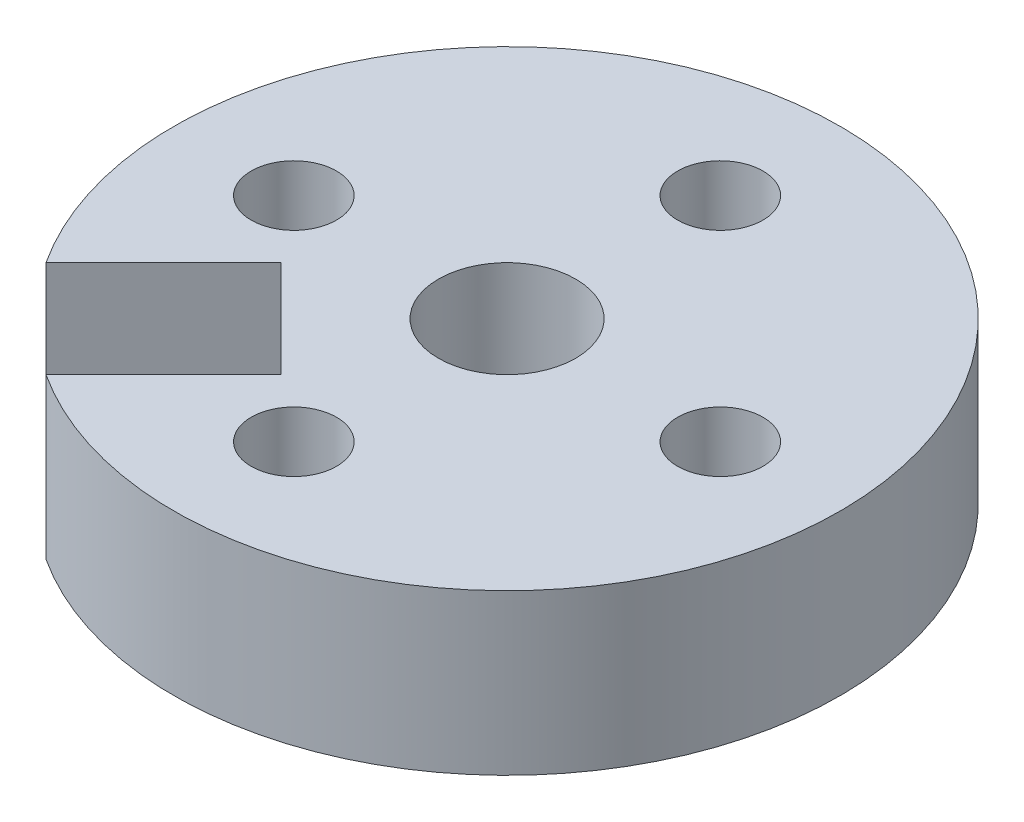
ISO-10303-21;
HEADER;
FILE_DESCRIPTION(('STEP AP214'),'2;1');
FILE_NAME('part.step','',(''),(''),'','','');
FILE_SCHEMA(('AUTOMOTIVE_DESIGN { 1 0 10303 214 1 1 1 1 }'));
ENDSEC;
DATA;
#1=APPLICATION_CONTEXT('core data for automotive mechanical design processes');
#2=APPLICATION_PROTOCOL_DEFINITION('international standard','automotive_design',2000,#1);
#3=PRODUCT_CONTEXT('',#1,'mechanical');
#4=PRODUCT('Part','Part','',(#3));
#5=PRODUCT_RELATED_PRODUCT_CATEGORY('part','',(#4));
#6=PRODUCT_DEFINITION_FORMATION('','',#4);
#7=PRODUCT_DEFINITION_CONTEXT('part definition',#1,'design');
#8=PRODUCT_DEFINITION('design','',#6,#7);
#9=PRODUCT_DEFINITION_SHAPE('','',#8);
#10=(LENGTH_UNIT() NAMED_UNIT(*) SI_UNIT(.MILLI.,.METRE.));
#11=(NAMED_UNIT(*) PLANE_ANGLE_UNIT() SI_UNIT($,.RADIAN.));
#12=(NAMED_UNIT(*) SI_UNIT($,.STERADIAN.) SOLID_ANGLE_UNIT());
#13=UNCERTAINTY_MEASURE_WITH_UNIT(LENGTH_MEASURE(1.E-05),#10,'distance_accuracy_value','');
#14=(GEOMETRIC_REPRESENTATION_CONTEXT(3) GLOBAL_UNCERTAINTY_ASSIGNED_CONTEXT((#13)) GLOBAL_UNIT_ASSIGNED_CONTEXT((#10,
#11,#12)) REPRESENTATION_CONTEXT('',''));
#15=CARTESIAN_POINT('',(0.,0.,0.));
#16=DIRECTION('',(0.,0.,1.));
#17=DIRECTION('',(1.,0.,0.));
#18=AXIS2_PLACEMENT_3D('',#15,#16,#17);
#19=CARTESIAN_POINT('',(0.,6.,0.));
#20=DIRECTION('',(0.,-1.,0.));
#21=DIRECTION('',(0.,0.,-1.));
#22=AXIS2_PLACEMENT_3D('',#19,#20,#21);
#23=CYLINDRICAL_SURFACE('',#22,12.5);
#24=DIRECTION('',(0.,-1.,0.));
#25=VECTOR('',#24,1.);
#26=CARTESIAN_POINT('',(-10.4700593229111,30.,6.82845939980044));
#27=LINE('',#26,#25);
#28=CARTESIAN_POINT('',(-10.4700593229111,6.,6.82845939980044));
#29=VERTEX_POINT('',#28);
#30=CARTESIAN_POINT('',(-10.4700593229111,0.,6.82845939980044));
#31=VERTEX_POINT('',#30);
#32=EDGE_CURVE('E112',#29,#31,#27,.T.);
#33=ORIENTED_EDGE('',*,*,#32,.F.);
#34=CARTESIAN_POINT('',(0.,6.,0.));
#35=DIRECTION('',(0.,1.,0.));
#36=DIRECTION('',(0.,0.,1.));
#37=AXIS2_PLACEMENT_3D('',#34,#35,#36);
#38=CIRCLE('',#37,12.5);
#39=CARTESIAN_POINT('',(-6.8284593998006,6.,10.470059322911));
#40=VERTEX_POINT('',#39);
#41=EDGE_CURVE('E12',#40,#29,#38,.T.);
#42=ORIENTED_EDGE('',*,*,#41,.F.);
#43=DIRECTION('',(0.,-1.,0.));
#44=VECTOR('',#43,1.);
#45=CARTESIAN_POINT('',(-6.8284593998006,30.,10.470059322911));
#46=LINE('',#45,#44);
#47=CARTESIAN_POINT('',(-6.8284593998006,0.,10.470059322911));
#48=VERTEX_POINT('',#47);
#49=EDGE_CURVE('E101',#40,#48,#46,.T.);
#50=ORIENTED_EDGE('',*,*,#49,.T.);
#51=CARTESIAN_POINT('',(0.,0.,0.));
#52=DIRECTION('',(0.,1.,0.));
#53=DIRECTION('',(0.,0.,1.));
#54=AXIS2_PLACEMENT_3D('',#51,#52,#53);
#55=CIRCLE('',#54,12.5);
#56=EDGE_CURVE('E65',#48,#31,#55,.T.);
#57=ORIENTED_EDGE('',*,*,#56,.T.);
#58=EDGE_LOOP('',(#33,#42,#50,#57));
#59=FACE_BOUND('',#58,.T.);
#60=ADVANCED_FACE('F52',(#59),#23,.T.);
#61=CARTESIAN_POINT('',(0.,6.,0.));
#62=DIRECTION('',(0.,1.,0.));
#63=DIRECTION('',(0.,0.,1.));
#64=AXIS2_PLACEMENT_3D('',#61,#62,#63);
#65=PLANE('',#64);
#66=CARTESIAN_POINT('',(0.,6.,0.));
#67=DIRECTION('',(0.,1.,0.));
#68=DIRECTION('',(0.,0.,1.));
#69=AXIS2_PLACEMENT_3D('',#66,#67,#68);
#70=CIRCLE('',#69,2.575);
#71=CARTESIAN_POINT('',(0.,6.,2.575));
#72=VERTEX_POINT('',#71);
#73=EDGE_CURVE('E135',#72,#72,#70,.T.);
#74=ORIENTED_EDGE('',*,*,#73,.F.);
#75=EDGE_LOOP('',(#74));
#76=FACE_BOUND('',#75,.T.);
#77=CARTESIAN_POINT('',(0.,6.,-8.));
#78=DIRECTION('',(0.,1.,0.));
#79=DIRECTION('',(0.,0.,1.));
#80=AXIS2_PLACEMENT_3D('',#77,#78,#79);
#81=CIRCLE('',#80,1.6);
#82=CARTESIAN_POINT('',(0.,6.,-6.4));
#83=VERTEX_POINT('',#82);
#84=EDGE_CURVE('E117',#83,#83,#81,.F.);
#85=ORIENTED_EDGE('',*,*,#84,.T.);
#86=EDGE_LOOP('',(#85));
#87=FACE_BOUND('',#86,.T.);
#88=CARTESIAN_POINT('',(8.,6.,0.));
#89=DIRECTION('',(0.,1.,0.));
#90=DIRECTION('',(0.,0.,1.));
#91=AXIS2_PLACEMENT_3D('',#88,#89,#90);
#92=CIRCLE('',#91,1.60000000000003);
#93=CARTESIAN_POINT('',(8.,6.,1.60000000000003));
#94=VERTEX_POINT('',#93);
#95=EDGE_CURVE('E119',#94,#94,#92,.F.);
#96=ORIENTED_EDGE('',*,*,#95,.T.);
#97=EDGE_LOOP('',(#96));
#98=FACE_BOUND('',#97,.T.);
#99=CARTESIAN_POINT('',(0.,6.,8.));
#100=DIRECTION('',(0.,1.,0.));
#101=DIRECTION('',(0.,0.,1.));
#102=AXIS2_PLACEMENT_3D('',#99,#100,#101);
#103=CIRCLE('',#102,1.60000000000006);
#104=CARTESIAN_POINT('',(0.,6.,9.60000000000006));
#105=VERTEX_POINT('',#104);
#106=EDGE_CURVE('E124',#105,#105,#103,.F.);
#107=ORIENTED_EDGE('',*,*,#106,.T.);
#108=EDGE_LOOP('',(#107));
#109=FACE_BOUND('',#108,.T.);
#110=CARTESIAN_POINT('',(-8.,6.,0.));
#111=DIRECTION('',(0.,1.,0.));
#112=DIRECTION('',(0.,0.,1.));
#113=AXIS2_PLACEMENT_3D('',#110,#111,#112);
#114=CIRCLE('',#113,1.60000000000008);
#115=CARTESIAN_POINT('',(-8.,6.,1.60000000000008));
#116=VERTEX_POINT('',#115);
#117=EDGE_CURVE('E127',#116,#116,#114,.F.);
#118=ORIENTED_EDGE('',*,*,#117,.T.);
#119=EDGE_LOOP('',(#118));
#120=FACE_BOUND('',#119,.T.);
#121=ORIENTED_EDGE('',*,*,#41,.T.);
#122=DIRECTION('',(0.707106781186544,0.,-0.707106781186551));
#123=VECTOR('',#122,1.);
#124=CARTESIAN_POINT('',(-1.82079996155537,6.,-1.82079996155535));
#125=LINE('',#124,#123);
#126=CARTESIAN_POINT('',(-6.06344064867468,6.,2.421840725564));
#127=VERTEX_POINT('',#126);
#128=EDGE_CURVE('E146',#29,#127,#125,.T.);
#129=ORIENTED_EDGE('',*,*,#128,.T.);
#130=DIRECTION('',(0.707106781186551,0.,0.707106781186544));
#131=VECTOR('',#130,1.);
#132=CARTESIAN_POINT('',(-4.24264068711931,6.,4.24264068711935));
#133=LINE('',#132,#131);
#134=CARTESIAN_POINT('',(-2.42184072556394,6.,6.06344064867471));
#135=VERTEX_POINT('',#134);
#136=EDGE_CURVE('E78',#127,#135,#133,.T.);
#137=ORIENTED_EDGE('',*,*,#136,.T.);
#138=DIRECTION('',(0.707106781186579,0.,-0.707106781186516));
#139=VECTOR('',#138,1.);
#140=CARTESIAN_POINT('',(1.82079996155549,6.,1.82079996155566));
#141=LINE('',#140,#139);
#142=EDGE_CURVE('E149',#40,#135,#141,.T.);
#143=ORIENTED_EDGE('',*,*,#142,.F.);
#144=EDGE_LOOP('',(#121,#129,#137,#143));
#145=FACE_BOUND('',#144,.T.);
#146=ADVANCED_FACE('F177',(#76,#87,#98,#109,#120,#145),#65,.T.);
#147=CARTESIAN_POINT('',(0.,0.,0.));
#148=DIRECTION('',(0.,1.,0.));
#149=DIRECTION('',(0.,0.,1.));
#150=AXIS2_PLACEMENT_3D('',#147,#148,#149);
#151=PLANE('',#150);
#152=CARTESIAN_POINT('',(0.,0.,0.));
#153=DIRECTION('',(0.,-1.,0.));
#154=DIRECTION('',(0.,0.,-1.));
#155=AXIS2_PLACEMENT_3D('',#152,#153,#154);
#156=CIRCLE('',#155,2.575);
#157=CARTESIAN_POINT('',(0.,0.,-2.575));
#158=VERTEX_POINT('',#157);
#159=EDGE_CURVE('E157',#158,#158,#156,.T.);
#160=ORIENTED_EDGE('',*,*,#159,.F.);
#161=EDGE_LOOP('',(#160));
#162=FACE_BOUND('',#161,.T.);
#163=CARTESIAN_POINT('',(-8.,0.,0.));
#164=DIRECTION('',(0.,1.,0.));
#165=DIRECTION('',(0.,0.,1.));
#166=AXIS2_PLACEMENT_3D('',#163,#164,#165);
#167=CIRCLE('',#166,1.60000000000008);
#168=CARTESIAN_POINT('',(-8.,0.,1.60000000000008));
#169=VERTEX_POINT('',#168);
#170=EDGE_CURVE('E131',#169,#169,#167,.T.);
#171=ORIENTED_EDGE('',*,*,#170,.T.);
#172=EDGE_LOOP('',(#171));
#173=FACE_BOUND('',#172,.T.);
#174=CARTESIAN_POINT('',(0.,0.,8.));
#175=DIRECTION('',(0.,1.,0.));
#176=DIRECTION('',(0.,0.,1.));
#177=AXIS2_PLACEMENT_3D('',#174,#175,#176);
#178=CIRCLE('',#177,1.60000000000006);
#179=CARTESIAN_POINT('',(0.,0.,9.60000000000006));
#180=VERTEX_POINT('',#179);
#181=EDGE_CURVE('E134',#180,#180,#178,.T.);
#182=ORIENTED_EDGE('',*,*,#181,.T.);
#183=EDGE_LOOP('',(#182));
#184=FACE_BOUND('',#183,.T.);
#185=CARTESIAN_POINT('',(8.,0.,0.));
#186=DIRECTION('',(0.,1.,0.));
#187=DIRECTION('',(0.,0.,1.));
#188=AXIS2_PLACEMENT_3D('',#185,#186,#187);
#189=CIRCLE('',#188,1.60000000000003);
#190=CARTESIAN_POINT('',(8.,0.,1.60000000000003));
#191=VERTEX_POINT('',#190);
#192=EDGE_CURVE('E138',#191,#191,#189,.T.);
#193=ORIENTED_EDGE('',*,*,#192,.T.);
#194=EDGE_LOOP('',(#193));
#195=FACE_BOUND('',#194,.T.);
#196=CARTESIAN_POINT('',(0.,0.,-8.));
#197=DIRECTION('',(0.,1.,0.));
#198=DIRECTION('',(0.,0.,1.));
#199=AXIS2_PLACEMENT_3D('',#196,#197,#198);
#200=CIRCLE('',#199,1.6);
#201=CARTESIAN_POINT('',(0.,0.,-6.4));
#202=VERTEX_POINT('',#201);
#203=EDGE_CURVE('E130',#202,#202,#200,.T.);
#204=ORIENTED_EDGE('',*,*,#203,.T.);
#205=EDGE_LOOP('',(#204));
#206=FACE_BOUND('',#205,.T.);
#207=DIRECTION('',(-0.707106781186544,0.,0.707106781186551));
#208=VECTOR('',#207,1.);
#209=CARTESIAN_POINT('',(-1.82079996155537,0.,-1.82079996155535));
#210=LINE('',#209,#208);
#211=CARTESIAN_POINT('',(-6.06344064867468,0.,2.421840725564));
#212=VERTEX_POINT('',#211);
#213=EDGE_CURVE('E106',#212,#31,#210,.T.);
#214=ORIENTED_EDGE('',*,*,#213,.T.);
#215=ORIENTED_EDGE('',*,*,#56,.F.);
#216=DIRECTION('',(-0.707106781186579,0.,0.707106781186516));
#217=VECTOR('',#216,1.);
#218=CARTESIAN_POINT('',(1.82079996155549,0.,1.82079996155566));
#219=LINE('',#218,#217);
#220=CARTESIAN_POINT('',(-2.42184072556394,0.,6.06344064867471));
#221=VERTEX_POINT('',#220);
#222=EDGE_CURVE('E98',#221,#48,#219,.T.);
#223=ORIENTED_EDGE('',*,*,#222,.F.);
#224=DIRECTION('',(-0.707106781186551,0.,-0.707106781186544));
#225=VECTOR('',#224,1.);
#226=CARTESIAN_POINT('',(-4.24264068711931,0.,4.24264068711935));
#227=LINE('',#226,#225);
#228=EDGE_CURVE('E73',#221,#212,#227,.T.);
#229=ORIENTED_EDGE('',*,*,#228,.T.);
#230=EDGE_LOOP('',(#214,#215,#223,#229));
#231=FACE_BOUND('',#230,.T.);
#232=ADVANCED_FACE('F115',(#162,#173,#184,#195,#206,#231),#151,.F.);
#233=CARTESIAN_POINT('',(-8.,30.,0.));
#234=DIRECTION('',(0.,-1.,0.));
#235=DIRECTION('',(0.,0.,-1.));
#236=AXIS2_PLACEMENT_3D('',#233,#234,#235);
#237=CYLINDRICAL_SURFACE('',#236,1.60000000000008);
#238=ORIENTED_EDGE('',*,*,#117,.F.);
#239=EDGE_LOOP('',(#238));
#240=FACE_BOUND('',#239,.T.);
#241=ORIENTED_EDGE('',*,*,#170,.F.);
#242=EDGE_LOOP('',(#241));
#243=FACE_BOUND('',#242,.T.);
#244=ADVANCED_FACE('F186',(#240,#243),#237,.F.);
#245=CARTESIAN_POINT('',(0.,30.,8.));
#246=DIRECTION('',(0.,-1.,0.));
#247=DIRECTION('',(0.,0.,-1.));
#248=AXIS2_PLACEMENT_3D('',#245,#246,#247);
#249=CYLINDRICAL_SURFACE('',#248,1.60000000000006);
#250=ORIENTED_EDGE('',*,*,#106,.F.);
#251=EDGE_LOOP('',(#250));
#252=FACE_BOUND('',#251,.T.);
#253=ORIENTED_EDGE('',*,*,#181,.F.);
#254=EDGE_LOOP('',(#253));
#255=FACE_BOUND('',#254,.T.);
#256=ADVANCED_FACE('F193',(#252,#255),#249,.F.);
#257=CARTESIAN_POINT('',(8.,30.,0.));
#258=DIRECTION('',(0.,-1.,0.));
#259=DIRECTION('',(0.,0.,-1.));
#260=AXIS2_PLACEMENT_3D('',#257,#258,#259);
#261=CYLINDRICAL_SURFACE('',#260,1.60000000000003);
#262=ORIENTED_EDGE('',*,*,#95,.F.);
#263=EDGE_LOOP('',(#262));
#264=FACE_BOUND('',#263,.T.);
#265=ORIENTED_EDGE('',*,*,#192,.F.);
#266=EDGE_LOOP('',(#265));
#267=FACE_BOUND('',#266,.T.);
#268=ADVANCED_FACE('F197',(#264,#267),#261,.F.);
#269=CARTESIAN_POINT('',(0.,30.,-8.));
#270=DIRECTION('',(0.,-1.,0.));
#271=DIRECTION('',(0.,0.,-1.));
#272=AXIS2_PLACEMENT_3D('',#269,#270,#271);
#273=CYLINDRICAL_SURFACE('',#272,1.6);
#274=ORIENTED_EDGE('',*,*,#84,.F.);
#275=EDGE_LOOP('',(#274));
#276=FACE_BOUND('',#275,.T.);
#277=ORIENTED_EDGE('',*,*,#203,.F.);
#278=EDGE_LOOP('',(#277));
#279=FACE_BOUND('',#278,.T.);
#280=ADVANCED_FACE('F201',(#276,#279),#273,.F.);
#281=CARTESIAN_POINT('',(-4.24264068711931,30.,4.24264068711935));
#282=DIRECTION('',(-0.707106781186544,0.,0.707106781186551));
#283=DIRECTION('',(0.707106781186551,0.,0.707106781186544));
#284=AXIS2_PLACEMENT_3D('',#281,#282,#283);
#285=PLANE('',#284);
#286=CARTESIAN_POINT('',(-4.24264068711931,3.,4.24264068711935));
#287=DIRECTION('',(-0.707106781186544,0.,0.707106781186551));
#288=DIRECTION('',(0.707106781186551,0.,0.707106781186544));
#289=AXIS2_PLACEMENT_3D('',#286,#287,#288);
#290=CIRCLE('',#289,1.6);
#291=CARTESIAN_POINT('',(-3.11126983722083,3.,5.37401153701783));
#292=VERTEX_POINT('',#291);
#293=EDGE_CURVE('E160',#292,#292,#290,.T.);
#294=ORIENTED_EDGE('',*,*,#293,.F.);
#295=EDGE_LOOP('',(#294));
#296=FACE_BOUND('',#295,.T.);
#297=DIRECTION('',(0.,-1.,0.));
#298=VECTOR('',#297,1.);
#299=CARTESIAN_POINT('',(-6.06344064867468,30.,2.421840725564));
#300=LINE('',#299,#298);
#301=EDGE_CURVE('E151',#127,#212,#300,.T.);
#302=ORIENTED_EDGE('',*,*,#301,.T.);
#303=ORIENTED_EDGE('',*,*,#228,.F.);
#304=DIRECTION('',(0.,-1.,0.));
#305=VECTOR('',#304,1.);
#306=CARTESIAN_POINT('',(-2.42184072556394,30.,6.06344064867471));
#307=LINE('',#306,#305);
#308=EDGE_CURVE('E103',#135,#221,#307,.T.);
#309=ORIENTED_EDGE('',*,*,#308,.F.);
#310=ORIENTED_EDGE('',*,*,#136,.F.);
#311=EDGE_LOOP('',(#302,#303,#309,#310));
#312=FACE_BOUND('',#311,.T.);
#313=ADVANCED_FACE('F205',(#296,#312),#285,.T.);
#314=CARTESIAN_POINT('',(-1.82079996155537,30.,-1.82079996155535));
#315=DIRECTION('',(0.707106781186551,0.,0.707106781186544));
#316=DIRECTION('',(0.707106781186544,0.,-0.707106781186551));
#317=AXIS2_PLACEMENT_3D('',#314,#315,#316);
#318=PLANE('',#317);
#319=ORIENTED_EDGE('',*,*,#32,.T.);
#320=ORIENTED_EDGE('',*,*,#213,.F.);
#321=ORIENTED_EDGE('',*,*,#301,.F.);
#322=ORIENTED_EDGE('',*,*,#128,.F.);
#323=EDGE_LOOP('',(#319,#320,#321,#322));
#324=FACE_BOUND('',#323,.T.);
#325=ADVANCED_FACE('F209',(#324),#318,.T.);
#326=CARTESIAN_POINT('',(1.82079996155549,30.,1.82079996155566));
#327=DIRECTION('',(0.707106781186516,0.,0.707106781186579));
#328=DIRECTION('',(0.707106781186579,0.,-0.707106781186516));
#329=AXIS2_PLACEMENT_3D('',#326,#327,#328);
#330=PLANE('',#329);
#331=ORIENTED_EDGE('',*,*,#142,.T.);
#332=ORIENTED_EDGE('',*,*,#308,.T.);
#333=ORIENTED_EDGE('',*,*,#222,.T.);
#334=ORIENTED_EDGE('',*,*,#49,.F.);
#335=EDGE_LOOP('',(#331,#332,#333,#334));
#336=FACE_BOUND('',#335,.T.);
#337=ADVANCED_FACE('F100',(#336),#330,.F.);
#338=CARTESIAN_POINT('',(0.,30.,0.));
#339=DIRECTION('',(0.,-1.,0.));
#340=DIRECTION('',(0.,0.,-1.));
#341=AXIS2_PLACEMENT_3D('',#338,#339,#340);
#342=CYLINDRICAL_SURFACE('',#341,2.575);
#343=CARTESIAN_POINT('',(-0.295272938858889,3.,2.55801463865585));
#344=CARTESIAN_POINT('',(-0.295284837148729,3.07963398362986,2.55801727104428));
#345=CARTESIAN_POINT('',(-0.302911159193821,3.15939756818518,2.55716834115232));
#346=CARTESIAN_POINT('',(-0.332525146169924,3.31625081232568,2.55347942627845));
#347=CARTESIAN_POINT('',(-0.354552819738581,3.39333239080404,2.5506338928811));
#348=CARTESIAN_POINT('',(-0.410486501306265,3.54207544934516,2.54222532888717));
#349=CARTESIAN_POINT('',(-0.444290482278367,3.61377725306922,2.53668548289258));
#350=CARTESIAN_POINT('',(-0.521375398027056,3.75140421408545,2.5219694181243));
#351=CARTESIAN_POINT('',(-0.564656390570858,3.81732933616238,2.51279317718465));
#352=CARTESIAN_POINT('',(-0.664800191013179,3.95113360554577,2.48830434563075));
#353=CARTESIAN_POINT('',(-0.722702527851525,4.01811579961521,2.47234015612812));
#354=CARTESIAN_POINT('',(-0.84538928528276,4.14312682899916,2.43312496795922));
#355=CARTESIAN_POINT('',(-0.910179575905327,4.20114792255675,2.40986772058536));
#356=CARTESIAN_POINT('',(-1.05229791688103,4.31341408084917,2.35156634374928));
#357=CARTESIAN_POINT('',(-1.13020125906979,4.36639302990018,2.31545065535072));
#358=CARTESIAN_POINT('',(-1.28824306856812,4.45761045517173,2.23137538989413));
#359=CARTESIAN_POINT('',(-1.36837926176222,4.49586338056538,2.18342749880931));
#360=CARTESIAN_POINT('',(-1.51898706577598,4.55239699426877,2.08104300063322));
#361=CARTESIAN_POINT('',(-1.58961890044759,4.57230170151769,2.0277469677092));
#362=CARTESIAN_POINT('',(-1.72639630735813,4.59709704528785,1.91262651724211));
#363=CARTESIAN_POINT('',(-1.7925464512438,4.60200321394535,1.85081099168633));
#364=CARTESIAN_POINT('',(-1.90928793254596,4.5968656084054,1.72956027392669));
#365=CARTESIAN_POINT('',(-1.9607790706336,4.58871926932619,1.67089771007239));
#366=CARTESIAN_POINT('',(-2.0571015558613,4.56136351709323,1.55076882625681));
#367=CARTESIAN_POINT('',(-2.10193239921551,4.54215326759879,1.48930229466208));
#368=CARTESIAN_POINT('',(-2.1844642781303,4.49348839191139,1.36539622275744));
#369=CARTESIAN_POINT('',(-2.22214297959889,4.46400246500858,1.3029542727729));
#370=CARTESIAN_POINT('',(-2.29024657921473,4.3958874563088,1.1791497688049));
#371=CARTESIAN_POINT('',(-2.32066978897209,4.35725625051826,1.11778746913259));
#372=CARTESIAN_POINT('',(-2.37807645526249,4.26658151023942,0.990375121891546));
#373=CARTESIAN_POINT('',(-2.40416827962827,4.21346977979244,0.924684728822658));
#374=CARTESIAN_POINT('',(-2.44884546621832,4.09809876149055,0.798903859593671));
#375=CARTESIAN_POINT('',(-2.46741986775354,4.03582629588967,0.738821657817047));
#376=CARTESIAN_POINT('',(-2.50024970843655,3.89449003717204,0.619417173982458));
#377=CARTESIAN_POINT('',(-2.51364407227706,3.81429687066642,0.561183535559277));
#378=CARTESIAN_POINT('',(-2.53430668473415,3.64460174224835,0.458960133622475));
#379=CARTESIAN_POINT('',(-2.5415862719633,3.55511735691776,0.414944100180666));
#380=CARTESIAN_POINT('',(-2.55056450983134,3.39317150824175,0.354848201950744));
#381=CARTESIAN_POINT('',(-2.55322364486433,3.32235870990333,0.33447610249341));
#382=CARTESIAN_POINT('',(-2.55681788747886,3.17831626156754,0.305817201459243));
#383=CARTESIAN_POINT('',(-2.55775529764219,3.10508997299095,0.297514262065605));
#384=CARTESIAN_POINT('',(-2.55818247440395,2.95814622279703,0.293823813138548));
#385=CARTESIAN_POINT('',(-2.55766913455704,2.8844280449034,0.29846401807615));
#386=CARTESIAN_POINT('',(-2.55503348655004,2.73886834420674,0.320221601893878));
#387=CARTESIAN_POINT('',(-2.55290985227908,2.6670284186523,0.337349264006232));
#388=CARTESIAN_POINT('',(-2.54657871114846,2.52801073311156,0.382176090380618));
#389=CARTESIAN_POINT('',(-2.54240095050509,2.46078159118902,0.409723093416443));
#390=CARTESIAN_POINT('',(-2.5312925232843,2.33087193864907,0.473529159489918));
#391=CARTESIAN_POINT('',(-2.52436087211712,2.2681930643641,0.509791336602331));
#392=CARTESIAN_POINT('',(-2.5053514900214,2.13658161258255,0.596802967585755));
#393=CARTESIAN_POINT('',(-2.49254855439919,2.06870742654999,0.648995257441674));
#394=CARTESIAN_POINT('',(-2.46074124444558,1.94089199960585,0.760763655061657));
#395=CARTESIAN_POINT('',(-2.44173047495354,1.88095902943186,0.820347337839992));
#396=CARTESIAN_POINT('',(-2.39279835250133,1.76124377157338,0.954458341589093));
#397=CARTESIAN_POINT('',(-2.3616392908367,1.7029371129944,1.0298680753181));
#398=CARTESIAN_POINT('',(-2.28802492000946,1.59993485195523,1.18443153060542));
#399=CARTESIAN_POINT('',(-2.24557530593314,1.55523241167625,1.26358334810825));
#400=CARTESIAN_POINT('',(-2.15173843341258,1.48391294359176,1.41711911490361));
#401=CARTESIAN_POINT('',(-2.1010682481583,1.45634666579689,1.49149449667448));
#402=CARTESIAN_POINT('',(-1.9898496630004,1.41686898639244,1.63690617248929));
#403=CARTESIAN_POINT('',(-1.92931467629074,1.40493652387437,1.70794683413275));
#404=CARTESIAN_POINT('',(-1.80977785082316,1.39808854990188,1.83350265617772));
#405=CARTESIAN_POINT('',(-1.75183566781294,1.40094868512293,1.88891802178859));
#406=CARTESIAN_POINT('',(-1.63207961528986,1.41850935587959,1.99330007583307));
#407=CARTESIAN_POINT('',(-1.5702658834231,1.43320947068579,2.04226699333803));
#408=CARTESIAN_POINT('',(-1.44692016925861,1.47303271301148,2.13135177512991));
#409=CARTESIAN_POINT('',(-1.38544166201907,1.49780975320236,2.17170140594173));
#410=CARTESIAN_POINT('',(-1.26274646628986,1.55673438720141,2.24526583858563));
#411=CARTESIAN_POINT('',(-1.20152982547818,1.5908836193349,2.27847939116939));
#412=CARTESIAN_POINT('',(-1.0747299228867,1.67154157628993,2.34117330088984));
#413=CARTESIAN_POINT('',(-1.00936056745578,1.71897001105703,2.36989866553815));
#414=CARTESIAN_POINT('',(-0.883000601320573,1.8228517344739,2.41982671569873));
#415=CARTESIAN_POINT('',(-0.822015091283689,1.87931529696868,2.44102074789884));
#416=CARTESIAN_POINT('',(-0.69828643529787,2.00893646593534,2.4794726199253));
#417=CARTESIAN_POINT('',(-0.63652103579755,2.08332599325772,2.49574568758083));
#418=CARTESIAN_POINT('',(-0.524855851227517,2.24162980215416,2.52159461586294));
#419=CARTESIAN_POINT('',(-0.474948932834428,2.32553831258707,2.53117450945063));
#420=CARTESIAN_POINT('',(-0.400478861041856,2.48199003846269,2.54388322016287));
#421=CARTESIAN_POINT('',(-0.372752507614733,2.5529489057785,2.54796965274973));
#422=CARTESIAN_POINT('',(-0.329273711391701,2.69842783726802,2.5539573459757));
#423=CARTESIAN_POINT('',(-0.313482921301871,2.7729356718175,2.55586561491746));
#424=CARTESIAN_POINT('',(-0.301375520527642,2.87335752813835,2.55730386965827));
#425=CARTESIAN_POINT('',(-0.29909203785864,2.89862483190499,2.55757149027302));
#426=CARTESIAN_POINT('',(-0.296038671894831,2.94925702192457,2.5579264766666));
#427=CARTESIAN_POINT('',(-0.295269147065231,2.97462192986349,2.55801379975599));
#428=CARTESIAN_POINT('',(-0.295272938858889,3.,2.55801463865585));
#429=B_SPLINE_CURVE_WITH_KNOTS('',3,(#343,#344,#345,#346,#347,#348,#349,#350,#351,#352,#353,
#354,#355,#356,#357,#358,#359,#360,#361,#362,#363,#364,#365,#366,#367,#368,#369,#370,#371,#372,
#373,#374,#375,#376,#377,#378,#379,#380,#381,#382,#383,#384,#385,#386,#387,#388,#389,#390,#391,
#392,#393,#394,#395,#396,#397,#398,#399,#400,#401,#402,#403,#404,#405,#406,#407,#408,#409,#410,
#411,#412,#413,#414,#415,#416,#417,#418,#419,#420,#421,#422,#423,#424,#425,#426,#427,#428),
.UNSPECIFIED.,.T.,.F.,(4,2,2,2,2,2,2,2,2,2,2,2,2,2,2,2,2,2,2,2,2,2,2,2,2,2,2,2,2,2,2,2,2,2,2,2,
2,2,2,2,2,2,4),(0.,0.238785427006243,0.478237062936576,0.715663724503605,0.953091833347411,
1.22195564754506,1.49105045717396,1.79209298159784,2.0928393656387,2.36328298240493,
2.63344643904377,2.86775976226255,3.10209079996806,3.33714196354079,3.57224777146165,
3.83644920412692,4.10103447667334,4.3996010140918,4.69761269056822,4.91788467554455,
5.13786186045273,5.35831043224717,5.57894074544504,5.7964662010105,6.01406949785173,
6.27281714859829,6.5318322003266,6.83116547810962,7.13034805410013,7.41098630516645,
7.69124610769965,7.93070741270001,8.17016020890414,8.40200325147151,8.63388684768199,
8.89004945854107,9.14650544934422,9.43933892865974,9.73199580911367,9.95999938681221,
10.1872672701607,10.2633463349371,10.3394434110586),.UNSPECIFIED.);
#430=CARTESIAN_POINT('',(-0.295272938858889,3.,2.55801463865585));
#431=VERTEX_POINT('',#430);
#432=EDGE_CURVE('E55',#431,#431,#429,.T.);
#433=ORIENTED_EDGE('',*,*,#432,.T.);
#434=EDGE_LOOP('',(#433));
#435=FACE_BOUND('',#434,.T.);
#436=ORIENTED_EDGE('',*,*,#73,.T.);
#437=EDGE_LOOP('',(#436));
#438=FACE_BOUND('',#437,.T.);
#439=ORIENTED_EDGE('',*,*,#159,.T.);
#440=EDGE_LOOP('',(#439));
#441=FACE_BOUND('',#440,.T.);
#442=ADVANCED_FACE('F167',(#435,#438,#441),#342,.F.);
#443=CARTESIAN_POINT('',(0.,3.,0.));
#444=DIRECTION('',(-0.707106781186544,0.,0.707106781186551));
#445=DIRECTION('',(0.707106781186551,0.,0.707106781186544));
#446=AXIS2_PLACEMENT_3D('',#443,#444,#445);
#447=CYLINDRICAL_SURFACE('',#446,1.6);
#448=ORIENTED_EDGE('',*,*,#293,.T.);
#449=EDGE_LOOP('',(#448));
#450=FACE_BOUND('',#449,.T.);
#451=ORIENTED_EDGE('',*,*,#432,.F.);
#452=EDGE_LOOP('',(#451));
#453=FACE_BOUND('',#452,.T.);
#454=ADVANCED_FACE('F170',(#450,#453),#447,.F.);
#455=CLOSED_SHELL('',(#60,#146,#232,#244,#256,#268,#280,#313,#325,#337,#442,#454));
#456=MANIFOLD_SOLID_BREP('B2',#455);
#457=ADVANCED_BREP_SHAPE_REPRESENTATION('',(#18,#456),#14);
#458=SHAPE_DEFINITION_REPRESENTATION(#9,#457);
ENDSEC;
END-ISO-10303-21;
